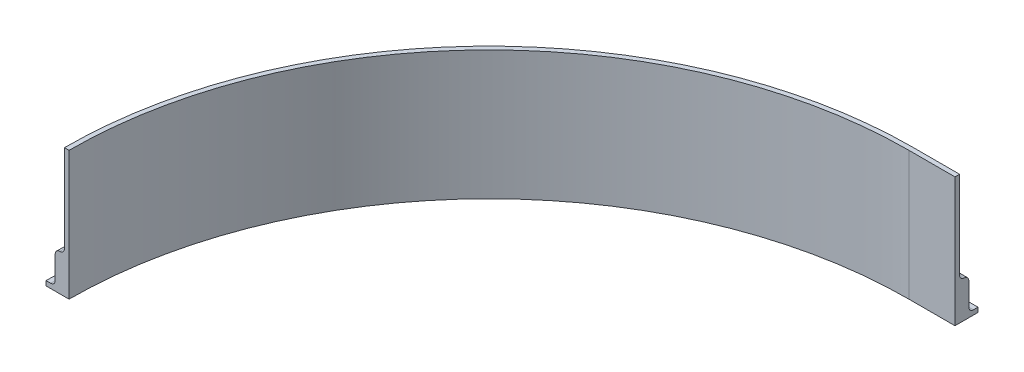
ISO-10303-21;
HEADER;
FILE_DESCRIPTION(('STEP AP214'),'2;1');
FILE_NAME('part.step','',(''),(''),'','','');
FILE_SCHEMA(('AUTOMOTIVE_DESIGN { 1 0 10303 214 1 1 1 1 }'));
ENDSEC;
DATA;
#1=APPLICATION_CONTEXT('core data for automotive mechanical design processes');
#2=APPLICATION_PROTOCOL_DEFINITION('international standard','automotive_design',2000,#1);
#3=PRODUCT_CONTEXT('',#1,'mechanical');
#4=PRODUCT('Part','Part','',(#3));
#5=PRODUCT_RELATED_PRODUCT_CATEGORY('part','',(#4));
#6=PRODUCT_DEFINITION_FORMATION('','',#4);
#7=PRODUCT_DEFINITION_CONTEXT('part definition',#1,'design');
#8=PRODUCT_DEFINITION('design','',#6,#7);
#9=PRODUCT_DEFINITION_SHAPE('','',#8);
#10=(LENGTH_UNIT() NAMED_UNIT(*) SI_UNIT(.MILLI.,.METRE.));
#11=(NAMED_UNIT(*) PLANE_ANGLE_UNIT() SI_UNIT($,.RADIAN.));
#12=(NAMED_UNIT(*) SI_UNIT($,.STERADIAN.) SOLID_ANGLE_UNIT());
#13=UNCERTAINTY_MEASURE_WITH_UNIT(LENGTH_MEASURE(1.E-05),#10,'distance_accuracy_value','');
#14=(GEOMETRIC_REPRESENTATION_CONTEXT(3) GLOBAL_UNCERTAINTY_ASSIGNED_CONTEXT((#13)) GLOBAL_UNIT_ASSIGNED_CONTEXT((#10,
#11,#12)) REPRESENTATION_CONTEXT('',''));
#15=CARTESIAN_POINT('',(0.,0.,0.));
#16=DIRECTION('',(0.,0.,1.));
#17=DIRECTION('',(1.,0.,0.));
#18=AXIS2_PLACEMENT_3D('',#15,#16,#17);
#19=CARTESIAN_POINT('',(481.,5.,0.));
#20=DIRECTION('',(0.,-1.,0.));
#21=DIRECTION('',(0.,0.,-1.));
#22=AXIS2_PLACEMENT_3D('',#19,#20,#21);
#23=PLANE('',#22);
#24=CARTESIAN_POINT('',(481.,5.,0.));
#25=DIRECTION('',(0.,-1.,0.));
#26=DIRECTION('',(0.,0.,-1.));
#27=AXIS2_PLACEMENT_3D('',#24,#25,#26);
#28=CIRCLE('',#27,476.);
#29=CARTESIAN_POINT('',(5.,5.,0.));
#30=VERTEX_POINT('',#29);
#31=CARTESIAN_POINT('',(481.,5.,-476.));
#32=VERTEX_POINT('',#31);
#33=EDGE_CURVE('E188',#30,#32,#28,.T.);
#34=ORIENTED_EDGE('',*,*,#33,.T.);
#35=DIRECTION('',(-1.,0.,0.));
#36=VECTOR('',#35,1.);
#37=CARTESIAN_POINT('',(531.,5.,-476.));
#38=LINE('',#37,#36);
#39=CARTESIAN_POINT('',(531.,5.,-476.));
#40=VERTEX_POINT('',#39);
#41=EDGE_CURVE('E186',#32,#40,#38,.F.);
#42=ORIENTED_EDGE('',*,*,#41,.T.);
#43=DIRECTION('',(0.,0.,-1.));
#44=VECTOR('',#43,1.);
#45=CARTESIAN_POINT('',(531.,5.,-481.));
#46=LINE('',#45,#44);
#47=CARTESIAN_POINT('',(531.,5.,-481.));
#48=VERTEX_POINT('',#47);
#49=EDGE_CURVE('E231',#40,#48,#46,.T.);
#50=ORIENTED_EDGE('',*,*,#49,.T.);
#51=DIRECTION('',(-1.,0.,0.));
#52=VECTOR('',#51,1.);
#53=CARTESIAN_POINT('',(481.,5.,-481.));
#54=LINE('',#53,#52);
#55=CARTESIAN_POINT('',(481.,5.,-481.));
#56=VERTEX_POINT('',#55);
#57=EDGE_CURVE('E214',#48,#56,#54,.T.);
#58=ORIENTED_EDGE('',*,*,#57,.T.);
#59=CARTESIAN_POINT('',(481.,5.,0.));
#60=DIRECTION('',(0.,1.,0.));
#61=DIRECTION('',(0.,0.,-1.));
#62=AXIS2_PLACEMENT_3D('',#59,#60,#61);
#63=CIRCLE('',#62,481.);
#64=CARTESIAN_POINT('',(0.,5.,0.));
#65=VERTEX_POINT('',#64);
#66=EDGE_CURVE('E217',#56,#65,#63,.T.);
#67=ORIENTED_EDGE('',*,*,#66,.T.);
#68=DIRECTION('',(1.,0.,0.));
#69=VECTOR('',#68,1.);
#70=CARTESIAN_POINT('',(0.,5.,0.));
#71=LINE('',#70,#69);
#72=EDGE_CURVE('E233',#65,#30,#71,.T.);
#73=ORIENTED_EDGE('',*,*,#72,.T.);
#74=EDGE_LOOP('',(#34,#42,#50,#58,#67,#73));
#75=FACE_BOUND('',#74,.T.);
#76=ADVANCED_FACE('F33',(#75),#23,.F.);
#77=CARTESIAN_POINT('',(481.,5.,0.));
#78=DIRECTION('',(0.,-1.,0.));
#79=DIRECTION('',(0.,0.,-1.));
#80=AXIS2_PLACEMENT_3D('',#77,#78,#79);
#81=CYLINDRICAL_SURFACE('',#80,481.);
#82=CARTESIAN_POINT('',(481.,0.,0.));
#83=DIRECTION('',(0.,1.,0.));
#84=DIRECTION('',(0.,0.,-1.));
#85=AXIS2_PLACEMENT_3D('',#82,#83,#84);
#86=CIRCLE('',#85,481.);
#87=CARTESIAN_POINT('',(481.,0.,-481.));
#88=VERTEX_POINT('',#87);
#89=CARTESIAN_POINT('',(0.,0.,0.));
#90=VERTEX_POINT('',#89);
#91=EDGE_CURVE('E226',#88,#90,#86,.T.);
#92=ORIENTED_EDGE('',*,*,#91,.T.);
#93=DIRECTION('',(0.,-1.,0.));
#94=VECTOR('',#93,1.);
#95=CARTESIAN_POINT('',(0.,5.,0.));
#96=LINE('',#95,#94);
#97=EDGE_CURVE('E198',#65,#90,#96,.T.);
#98=ORIENTED_EDGE('',*,*,#97,.F.);
#99=ORIENTED_EDGE('',*,*,#66,.F.);
#100=DIRECTION('',(0.,-1.,0.));
#101=VECTOR('',#100,1.);
#102=CARTESIAN_POINT('',(481.,5.,-481.));
#103=LINE('',#102,#101);
#104=EDGE_CURVE('E211',#56,#88,#103,.T.);
#105=ORIENTED_EDGE('',*,*,#104,.T.);
#106=EDGE_LOOP('',(#92,#98,#99,#105));
#107=FACE_BOUND('',#106,.T.);
#108=ADVANCED_FACE('F296',(#107),#81,.T.);
#109=CARTESIAN_POINT('',(0.,5.,0.));
#110=DIRECTION('',(0.,0.,-1.));
#111=DIRECTION('',(-1.,0.,0.));
#112=AXIS2_PLACEMENT_3D('',#109,#110,#111);
#113=PLANE('',#112);
#114=DIRECTION('',(0.,-1.,0.));
#115=VECTOR('',#114,1.);
#116=CARTESIAN_POINT('',(20.,140.,0.));
#117=LINE('',#116,#115);
#118=CARTESIAN_POINT('',(20.,140.,0.));
#119=VERTEX_POINT('',#118);
#120=CARTESIAN_POINT('',(20.,45.,0.));
#121=VERTEX_POINT('',#120);
#122=EDGE_CURVE('E250',#119,#121,#117,.T.);
#123=ORIENTED_EDGE('',*,*,#122,.T.);
#124=CARTESIAN_POINT('',(15.,45.,0.));
#125=DIRECTION('',(0.,0.,-1.));
#126=DIRECTION('',(-1.,0.,0.));
#127=AXIS2_PLACEMENT_3D('',#124,#125,#126);
#128=CIRCLE('',#127,5.);
#129=CARTESIAN_POINT('',(15.,40.,0.));
#130=VERTEX_POINT('',#129);
#131=EDGE_CURVE('E43',#121,#130,#128,.T.);
#132=ORIENTED_EDGE('',*,*,#131,.T.);
#133=CARTESIAN_POINT('',(15.,35.,0.));
#134=DIRECTION('',(0.,0.,-1.));
#135=DIRECTION('',(-1.,0.,0.));
#136=AXIS2_PLACEMENT_3D('',#133,#134,#135);
#137=CIRCLE('',#136,5.);
#138=CARTESIAN_POINT('',(10.,35.,0.));
#139=VERTEX_POINT('',#138);
#140=EDGE_CURVE('E160',#130,#139,#137,.F.);
#141=ORIENTED_EDGE('',*,*,#140,.T.);
#142=DIRECTION('',(0.,-1.,0.));
#143=VECTOR('',#142,1.);
#144=CARTESIAN_POINT('',(10.,40.,0.));
#145=LINE('',#144,#143);
#146=CARTESIAN_POINT('',(10.,10.,0.));
#147=VERTEX_POINT('',#146);
#148=EDGE_CURVE('E242',#139,#147,#145,.T.);
#149=ORIENTED_EDGE('',*,*,#148,.T.);
#150=CARTESIAN_POINT('',(5.,10.,0.));
#151=DIRECTION('',(0.,0.,-1.));
#152=DIRECTION('',(-1.,0.,0.));
#153=AXIS2_PLACEMENT_3D('',#150,#151,#152);
#154=CIRCLE('',#153,5.);
#155=EDGE_CURVE('E11',#147,#30,#154,.T.);
#156=ORIENTED_EDGE('',*,*,#155,.T.);
#157=ORIENTED_EDGE('',*,*,#72,.F.);
#158=ORIENTED_EDGE('',*,*,#97,.T.);
#159=DIRECTION('',(1.,0.,0.));
#160=VECTOR('',#159,1.);
#161=CARTESIAN_POINT('',(0.,0.,0.));
#162=LINE('',#161,#160);
#163=CARTESIAN_POINT('',(25.,0.,0.));
#164=VERTEX_POINT('',#163);
#165=EDGE_CURVE('E224',#90,#164,#162,.T.);
#166=ORIENTED_EDGE('',*,*,#165,.T.);
#167=DIRECTION('',(0.,-1.,0.));
#168=VECTOR('',#167,1.);
#169=CARTESIAN_POINT('',(25.,5.,0.));
#170=LINE('',#169,#168);
#171=CARTESIAN_POINT('',(25.,140.,0.));
#172=VERTEX_POINT('',#171);
#173=EDGE_CURVE('E201',#172,#164,#170,.T.);
#174=ORIENTED_EDGE('',*,*,#173,.F.);
#175=DIRECTION('',(1.,0.,0.));
#176=VECTOR('',#175,1.);
#177=CARTESIAN_POINT('',(20.,140.,0.));
#178=LINE('',#177,#176);
#179=EDGE_CURVE('E253',#119,#172,#178,.T.);
#180=ORIENTED_EDGE('',*,*,#179,.F.);
#181=EDGE_LOOP('',(#123,#132,#141,#149,#156,#157,#158,#166,#174,#180));
#182=FACE_BOUND('',#181,.T.);
#183=ADVANCED_FACE('F294',(#182),#113,.F.);
#184=CARTESIAN_POINT('',(481.,5.,0.));
#185=DIRECTION('',(0.,-1.,0.));
#186=DIRECTION('',(0.,0.,-1.));
#187=AXIS2_PLACEMENT_3D('',#184,#185,#186);
#188=CYLINDRICAL_SURFACE('',#187,456.);
#189=CARTESIAN_POINT('',(481.,0.,0.));
#190=DIRECTION('',(0.,-1.,0.));
#191=DIRECTION('',(0.,0.,-1.));
#192=AXIS2_PLACEMENT_3D('',#189,#190,#191);
#193=CIRCLE('',#192,456.);
#194=CARTESIAN_POINT('',(481.,0.,-456.));
#195=VERTEX_POINT('',#194);
#196=EDGE_CURVE('E222',#164,#195,#193,.T.);
#197=ORIENTED_EDGE('',*,*,#196,.T.);
#198=DIRECTION('',(0.,-1.,0.));
#199=VECTOR('',#198,1.);
#200=CARTESIAN_POINT('',(481.,5.,-456.));
#201=LINE('',#200,#199);
#202=CARTESIAN_POINT('',(481.,140.,-456.));
#203=VERTEX_POINT('',#202);
#204=EDGE_CURVE('E138',#203,#195,#201,.T.);
#205=ORIENTED_EDGE('',*,*,#204,.F.);
#206=CARTESIAN_POINT('',(481.,140.,0.));
#207=DIRECTION('',(0.,-1.,0.));
#208=DIRECTION('',(0.,0.,1.));
#209=AXIS2_PLACEMENT_3D('',#206,#207,#208);
#210=CIRCLE('',#209,456.);
#211=EDGE_CURVE('E155',#172,#203,#210,.T.);
#212=ORIENTED_EDGE('',*,*,#211,.F.);
#213=ORIENTED_EDGE('',*,*,#173,.T.);
#214=EDGE_LOOP('',(#197,#205,#212,#213));
#215=FACE_BOUND('',#214,.T.);
#216=ADVANCED_FACE('F270',(#215),#188,.F.);
#217=CARTESIAN_POINT('',(531.,5.,-456.));
#218=DIRECTION('',(0.,0.,-1.));
#219=DIRECTION('',(-1.,0.,0.));
#220=AXIS2_PLACEMENT_3D('',#217,#218,#219);
#221=PLANE('',#220);
#222=DIRECTION('',(1.,0.,0.));
#223=VECTOR('',#222,1.);
#224=CARTESIAN_POINT('',(531.,0.,-456.));
#225=LINE('',#224,#223);
#226=CARTESIAN_POINT('',(531.,0.,-456.));
#227=VERTEX_POINT('',#226);
#228=EDGE_CURVE('E220',#195,#227,#225,.T.);
#229=ORIENTED_EDGE('',*,*,#228,.T.);
#230=DIRECTION('',(0.,-1.,0.));
#231=VECTOR('',#230,1.);
#232=CARTESIAN_POINT('',(531.,5.,-456.));
#233=LINE('',#232,#231);
#234=CARTESIAN_POINT('',(531.,140.,-456.));
#235=VERTEX_POINT('',#234);
#236=EDGE_CURVE('E205',#235,#227,#233,.T.);
#237=ORIENTED_EDGE('',*,*,#236,.F.);
#238=DIRECTION('',(1.,0.,0.));
#239=VECTOR('',#238,1.);
#240=CARTESIAN_POINT('',(481.,140.,-456.));
#241=LINE('',#240,#239);
#242=EDGE_CURVE('E262',#203,#235,#241,.T.);
#243=ORIENTED_EDGE('',*,*,#242,.F.);
#244=ORIENTED_EDGE('',*,*,#204,.T.);
#245=EDGE_LOOP('',(#229,#237,#243,#244));
#246=FACE_BOUND('',#245,.T.);
#247=ADVANCED_FACE('F280',(#246),#221,.F.);
#248=CARTESIAN_POINT('',(531.,5.,-481.));
#249=DIRECTION('',(-1.,0.,0.));
#250=DIRECTION('',(0.,0.,1.));
#251=AXIS2_PLACEMENT_3D('',#248,#249,#250);
#252=PLANE('',#251);
#253=DIRECTION('',(0.,-1.,0.));
#254=VECTOR('',#253,1.);
#255=CARTESIAN_POINT('',(531.,40.,-471.));
#256=LINE('',#255,#254);
#257=CARTESIAN_POINT('',(531.,35.,-471.));
#258=VERTEX_POINT('',#257);
#259=CARTESIAN_POINT('',(531.,10.,-471.));
#260=VERTEX_POINT('',#259);
#261=EDGE_CURVE('E229',#258,#260,#256,.T.);
#262=ORIENTED_EDGE('',*,*,#261,.F.);
#263=CARTESIAN_POINT('',(531.,35.,-466.));
#264=DIRECTION('',(-1.,0.,0.));
#265=DIRECTION('',(0.,0.,1.));
#266=AXIS2_PLACEMENT_3D('',#263,#264,#265);
#267=CIRCLE('',#266,5.);
#268=CARTESIAN_POINT('',(531.,40.,-466.));
#269=VERTEX_POINT('',#268);
#270=EDGE_CURVE('E190',#258,#269,#267,.F.);
#271=ORIENTED_EDGE('',*,*,#270,.T.);
#272=CARTESIAN_POINT('',(531.,45.,-466.));
#273=DIRECTION('',(-1.,0.,0.));
#274=DIRECTION('',(0.,0.,1.));
#275=AXIS2_PLACEMENT_3D('',#272,#273,#274);
#276=CIRCLE('',#275,5.);
#277=CARTESIAN_POINT('',(531.,45.,-461.));
#278=VERTEX_POINT('',#277);
#279=EDGE_CURVE('E170',#269,#278,#276,.T.);
#280=ORIENTED_EDGE('',*,*,#279,.T.);
#281=DIRECTION('',(0.,-1.,0.));
#282=VECTOR('',#281,1.);
#283=CARTESIAN_POINT('',(531.,140.,-461.));
#284=LINE('',#283,#282);
#285=CARTESIAN_POINT('',(531.,140.,-461.));
#286=VERTEX_POINT('',#285);
#287=EDGE_CURVE('E244',#286,#278,#284,.T.);
#288=ORIENTED_EDGE('',*,*,#287,.F.);
#289=DIRECTION('',(0.,0.,-1.));
#290=VECTOR('',#289,1.);
#291=CARTESIAN_POINT('',(531.,140.,-461.));
#292=LINE('',#291,#290);
#293=EDGE_CURVE('E260',#235,#286,#292,.T.);
#294=ORIENTED_EDGE('',*,*,#293,.F.);
#295=ORIENTED_EDGE('',*,*,#236,.T.);
#296=DIRECTION('',(0.,0.,-1.));
#297=VECTOR('',#296,1.);
#298=CARTESIAN_POINT('',(531.,0.,-481.));
#299=LINE('',#298,#297);
#300=CARTESIAN_POINT('',(531.,0.,-481.));
#301=VERTEX_POINT('',#300);
#302=EDGE_CURVE('E218',#227,#301,#299,.T.);
#303=ORIENTED_EDGE('',*,*,#302,.T.);
#304=DIRECTION('',(0.,-1.,0.));
#305=VECTOR('',#304,1.);
#306=CARTESIAN_POINT('',(531.,5.,-481.));
#307=LINE('',#306,#305);
#308=EDGE_CURVE('E208',#48,#301,#307,.T.);
#309=ORIENTED_EDGE('',*,*,#308,.F.);
#310=ORIENTED_EDGE('',*,*,#49,.F.);
#311=CARTESIAN_POINT('',(531.,10.,-476.));
#312=DIRECTION('',(-1.,0.,0.));
#313=DIRECTION('',(0.,0.,1.));
#314=AXIS2_PLACEMENT_3D('',#311,#312,#313);
#315=CIRCLE('',#314,5.);
#316=EDGE_CURVE('E178',#40,#260,#315,.T.);
#317=ORIENTED_EDGE('',*,*,#316,.T.);
#318=EDGE_LOOP('',(#262,#271,#280,#288,#294,#295,#303,#309,#310,#317));
#319=FACE_BOUND('',#318,.T.);
#320=ADVANCED_FACE('F283',(#319),#252,.F.);
#321=CARTESIAN_POINT('',(481.,5.,-481.));
#322=DIRECTION('',(0.,0.,1.));
#323=DIRECTION('',(1.,0.,0.));
#324=AXIS2_PLACEMENT_3D('',#321,#322,#323);
#325=PLANE('',#324);
#326=DIRECTION('',(-1.,0.,0.));
#327=VECTOR('',#326,1.);
#328=CARTESIAN_POINT('',(481.,0.,-481.));
#329=LINE('',#328,#327);
#330=EDGE_CURVE('E215',#301,#88,#329,.T.);
#331=ORIENTED_EDGE('',*,*,#330,.T.);
#332=ORIENTED_EDGE('',*,*,#104,.F.);
#333=ORIENTED_EDGE('',*,*,#57,.F.);
#334=ORIENTED_EDGE('',*,*,#308,.T.);
#335=EDGE_LOOP('',(#331,#332,#333,#334));
#336=FACE_BOUND('',#335,.T.);
#337=ADVANCED_FACE('F316',(#336),#325,.F.);
#338=CARTESIAN_POINT('',(481.,0.,0.));
#339=DIRECTION('',(0.,-1.,0.));
#340=DIRECTION('',(0.,0.,-1.));
#341=AXIS2_PLACEMENT_3D('',#338,#339,#340);
#342=PLANE('',#341);
#343=ORIENTED_EDGE('',*,*,#91,.F.);
#344=ORIENTED_EDGE('',*,*,#330,.F.);
#345=ORIENTED_EDGE('',*,*,#302,.F.);
#346=ORIENTED_EDGE('',*,*,#228,.F.);
#347=ORIENTED_EDGE('',*,*,#196,.F.);
#348=ORIENTED_EDGE('',*,*,#165,.F.);
#349=EDGE_LOOP('',(#343,#344,#345,#346,#347,#348));
#350=FACE_BOUND('',#349,.T.);
#351=ADVANCED_FACE('F276',(#350),#342,.T.);
#352=CARTESIAN_POINT('',(481.,40.,-471.));
#353=DIRECTION('',(0.,0.,1.));
#354=DIRECTION('',(1.,0.,0.));
#355=AXIS2_PLACEMENT_3D('',#352,#353,#354);
#356=PLANE('',#355);
#357=DIRECTION('',(0.,-1.,0.));
#358=VECTOR('',#357,1.);
#359=CARTESIAN_POINT('',(481.,40.,-471.));
#360=LINE('',#359,#358);
#361=CARTESIAN_POINT('',(481.,35.,-471.));
#362=VERTEX_POINT('',#361);
#363=CARTESIAN_POINT('',(481.,10.,-471.));
#364=VERTEX_POINT('',#363);
#365=EDGE_CURVE('E240',#362,#364,#360,.T.);
#366=ORIENTED_EDGE('',*,*,#365,.F.);
#367=DIRECTION('',(-1.,0.,0.));
#368=VECTOR('',#367,1.);
#369=CARTESIAN_POINT('',(531.,35.,-471.));
#370=LINE('',#369,#368);
#371=EDGE_CURVE('E152',#362,#258,#370,.F.);
#372=ORIENTED_EDGE('',*,*,#371,.T.);
#373=ORIENTED_EDGE('',*,*,#261,.T.);
#374=DIRECTION('',(-1.,0.,0.));
#375=VECTOR('',#374,1.);
#376=CARTESIAN_POINT('',(481.,10.,-471.));
#377=LINE('',#376,#375);
#378=EDGE_CURVE('E193',#260,#364,#377,.T.);
#379=ORIENTED_EDGE('',*,*,#378,.T.);
#380=EDGE_LOOP('',(#366,#372,#373,#379));
#381=FACE_BOUND('',#380,.T.);
#382=ADVANCED_FACE('F312',(#381),#356,.F.);
#383=CARTESIAN_POINT('',(481.,40.,0.));
#384=DIRECTION('',(0.,-1.,0.));
#385=DIRECTION('',(0.,0.,-1.));
#386=AXIS2_PLACEMENT_3D('',#383,#384,#385);
#387=CYLINDRICAL_SURFACE('',#386,471.);
#388=ORIENTED_EDGE('',*,*,#148,.F.);
#389=CARTESIAN_POINT('',(481.,35.,0.));
#390=DIRECTION('',(0.,1.,0.));
#391=DIRECTION('',(0.,0.,1.));
#392=AXIS2_PLACEMENT_3D('',#389,#390,#391);
#393=CIRCLE('',#392,471.);
#394=EDGE_CURVE('E181',#139,#362,#393,.F.);
#395=ORIENTED_EDGE('',*,*,#394,.T.);
#396=ORIENTED_EDGE('',*,*,#365,.T.);
#397=CARTESIAN_POINT('',(481.,10.,0.));
#398=DIRECTION('',(0.,-1.,0.));
#399=DIRECTION('',(0.,0.,-1.));
#400=AXIS2_PLACEMENT_3D('',#397,#398,#399);
#401=CIRCLE('',#400,471.);
#402=EDGE_CURVE('E51',#364,#147,#401,.F.);
#403=ORIENTED_EDGE('',*,*,#402,.T.);
#404=EDGE_LOOP('',(#388,#395,#396,#403));
#405=FACE_BOUND('',#404,.T.);
#406=ADVANCED_FACE('F347',(#405),#387,.T.);
#407=CARTESIAN_POINT('',(481.,140.,-461.));
#408=DIRECTION('',(0.,0.,1.));
#409=DIRECTION('',(1.,0.,0.));
#410=AXIS2_PLACEMENT_3D('',#407,#408,#409);
#411=PLANE('',#410);
#412=ORIENTED_EDGE('',*,*,#287,.T.);
#413=DIRECTION('',(-1.,0.,0.));
#414=VECTOR('',#413,1.);
#415=CARTESIAN_POINT('',(481.,45.,-461.));
#416=LINE('',#415,#414);
#417=CARTESIAN_POINT('',(481.,45.,-461.));
#418=VERTEX_POINT('',#417);
#419=EDGE_CURVE('E196',#278,#418,#416,.T.);
#420=ORIENTED_EDGE('',*,*,#419,.T.);
#421=DIRECTION('',(0.,-1.,0.));
#422=VECTOR('',#421,1.);
#423=CARTESIAN_POINT('',(481.,140.,-461.));
#424=LINE('',#423,#422);
#425=CARTESIAN_POINT('',(481.,140.,-461.));
#426=VERTEX_POINT('',#425);
#427=EDGE_CURVE('E247',#426,#418,#424,.T.);
#428=ORIENTED_EDGE('',*,*,#427,.F.);
#429=DIRECTION('',(-1.,0.,0.));
#430=VECTOR('',#429,1.);
#431=CARTESIAN_POINT('',(481.,140.,-461.));
#432=LINE('',#431,#430);
#433=EDGE_CURVE('E258',#286,#426,#432,.T.);
#434=ORIENTED_EDGE('',*,*,#433,.F.);
#435=EDGE_LOOP('',(#412,#420,#428,#434));
#436=FACE_BOUND('',#435,.T.);
#437=ADVANCED_FACE('F291',(#436),#411,.F.);
#438=CARTESIAN_POINT('',(481.,140.,0.));
#439=DIRECTION('',(0.,-1.,0.));
#440=DIRECTION('',(0.,0.,-1.));
#441=AXIS2_PLACEMENT_3D('',#438,#439,#440);
#442=CYLINDRICAL_SURFACE('',#441,461.);
#443=ORIENTED_EDGE('',*,*,#427,.T.);
#444=CARTESIAN_POINT('',(481.,45.,0.));
#445=DIRECTION('',(0.,1.,0.));
#446=DIRECTION('',(0.,0.,1.));
#447=AXIS2_PLACEMENT_3D('',#444,#445,#446);
#448=CIRCLE('',#447,461.);
#449=EDGE_CURVE('E173',#418,#121,#448,.T.);
#450=ORIENTED_EDGE('',*,*,#449,.T.);
#451=ORIENTED_EDGE('',*,*,#122,.F.);
#452=CARTESIAN_POINT('',(481.,140.,0.));
#453=DIRECTION('',(0.,1.,0.));
#454=DIRECTION('',(0.,0.,1.));
#455=AXIS2_PLACEMENT_3D('',#452,#453,#454);
#456=CIRCLE('',#455,461.);
#457=EDGE_CURVE('E256',#426,#119,#456,.T.);
#458=ORIENTED_EDGE('',*,*,#457,.F.);
#459=EDGE_LOOP('',(#443,#450,#451,#458));
#460=FACE_BOUND('',#459,.T.);
#461=ADVANCED_FACE('F293',(#460),#442,.T.);
#462=CARTESIAN_POINT('',(481.,140.,0.));
#463=DIRECTION('',(0.,1.,0.));
#464=DIRECTION('',(0.,0.,1.));
#465=AXIS2_PLACEMENT_3D('',#462,#463,#464);
#466=PLANE('',#465);
#467=ORIENTED_EDGE('',*,*,#211,.T.);
#468=ORIENTED_EDGE('',*,*,#242,.T.);
#469=ORIENTED_EDGE('',*,*,#293,.T.);
#470=ORIENTED_EDGE('',*,*,#433,.T.);
#471=ORIENTED_EDGE('',*,*,#457,.T.);
#472=ORIENTED_EDGE('',*,*,#179,.T.);
#473=EDGE_LOOP('',(#467,#468,#469,#470,#471,#472));
#474=FACE_BOUND('',#473,.T.);
#475=ADVANCED_FACE('F267',(#474),#466,.T.);
#476=CARTESIAN_POINT('',(481.,35.,0.));
#477=DIRECTION('',(0.,1.,0.));
#478=DIRECTION('',(0.,0.,1.));
#479=AXIS2_PLACEMENT_3D('',#476,#477,#478);
#480=TOROIDAL_SURFACE('',#479,466.,5.);
#481=CARTESIAN_POINT('',(481.,35.,-466.));
#482=DIRECTION('',(1.,0.,0.));
#483=DIRECTION('',(0.,0.,-1.));
#484=AXIS2_PLACEMENT_3D('',#481,#482,#483);
#485=CIRCLE('',#484,5.);
#486=CARTESIAN_POINT('',(481.,40.,-466.));
#487=VERTEX_POINT('',#486);
#488=EDGE_CURVE('E145',#362,#487,#485,.T.);
#489=ORIENTED_EDGE('',*,*,#488,.F.);
#490=ORIENTED_EDGE('',*,*,#394,.F.);
#491=ORIENTED_EDGE('',*,*,#140,.F.);
#492=CARTESIAN_POINT('',(481.,40.,0.));
#493=DIRECTION('',(0.,1.,0.));
#494=DIRECTION('',(0.,0.,1.));
#495=AXIS2_PLACEMENT_3D('',#492,#493,#494);
#496=CIRCLE('',#495,466.);
#497=EDGE_CURVE('E156',#487,#130,#496,.T.);
#498=ORIENTED_EDGE('',*,*,#497,.F.);
#499=EDGE_LOOP('',(#489,#490,#491,#498));
#500=FACE_BOUND('',#499,.T.);
#501=ADVANCED_FACE('F159',(#500),#480,.T.);
#502=CARTESIAN_POINT('',(481.,35.,-466.));
#503=DIRECTION('',(1.,0.,0.));
#504=DIRECTION('',(0.,0.,-1.));
#505=AXIS2_PLACEMENT_3D('',#502,#503,#504);
#506=CYLINDRICAL_SURFACE('',#505,5.);
#507=ORIENTED_EDGE('',*,*,#371,.F.);
#508=ORIENTED_EDGE('',*,*,#488,.T.);
#509=DIRECTION('',(-1.,0.,0.));
#510=VECTOR('',#509,1.);
#511=CARTESIAN_POINT('',(481.,40.,-466.));
#512=LINE('',#511,#510);
#513=EDGE_CURVE('E150',#269,#487,#512,.T.);
#514=ORIENTED_EDGE('',*,*,#513,.F.);
#515=ORIENTED_EDGE('',*,*,#270,.F.);
#516=EDGE_LOOP('',(#507,#508,#514,#515));
#517=FACE_BOUND('',#516,.T.);
#518=ADVANCED_FACE('F147',(#517),#506,.T.);
#519=CARTESIAN_POINT('',(481.,45.,0.));
#520=DIRECTION('',(0.,1.,0.));
#521=DIRECTION('',(0.,0.,1.));
#522=AXIS2_PLACEMENT_3D('',#519,#520,#521);
#523=TOROIDAL_SURFACE('',#522,466.,5.);
#524=ORIENTED_EDGE('',*,*,#131,.F.);
#525=ORIENTED_EDGE('',*,*,#449,.F.);
#526=CARTESIAN_POINT('',(481.,45.,-466.));
#527=DIRECTION('',(-1.,0.,0.));
#528=DIRECTION('',(0.,0.,1.));
#529=AXIS2_PLACEMENT_3D('',#526,#527,#528);
#530=CIRCLE('',#529,5.);
#531=EDGE_CURVE('E168',#487,#418,#530,.T.);
#532=ORIENTED_EDGE('',*,*,#531,.F.);
#533=ORIENTED_EDGE('',*,*,#497,.T.);
#534=EDGE_LOOP('',(#524,#525,#532,#533));
#535=FACE_BOUND('',#534,.T.);
#536=ADVANCED_FACE('F172',(#535),#523,.F.);
#537=CARTESIAN_POINT('',(481.,45.,-466.));
#538=DIRECTION('',(-1.,0.,0.));
#539=DIRECTION('',(0.,0.,1.));
#540=AXIS2_PLACEMENT_3D('',#537,#538,#539);
#541=CYLINDRICAL_SURFACE('',#540,5.);
#542=ORIENTED_EDGE('',*,*,#279,.F.);
#543=ORIENTED_EDGE('',*,*,#513,.T.);
#544=ORIENTED_EDGE('',*,*,#531,.T.);
#545=ORIENTED_EDGE('',*,*,#419,.F.);
#546=EDGE_LOOP('',(#542,#543,#544,#545));
#547=FACE_BOUND('',#546,.T.);
#548=ADVANCED_FACE('F166',(#547),#541,.F.);
#549=CARTESIAN_POINT('',(481.,10.,0.));
#550=DIRECTION('',(0.,-1.,0.));
#551=DIRECTION('',(0.,0.,-1.));
#552=AXIS2_PLACEMENT_3D('',#549,#550,#551);
#553=TOROIDAL_SURFACE('',#552,476.,5.);
#554=ORIENTED_EDGE('',*,*,#155,.F.);
#555=ORIENTED_EDGE('',*,*,#402,.F.);
#556=CARTESIAN_POINT('',(481.,10.,-476.));
#557=DIRECTION('',(-1.,0.,0.));
#558=DIRECTION('',(0.,0.,1.));
#559=AXIS2_PLACEMENT_3D('',#556,#557,#558);
#560=CIRCLE('',#559,5.);
#561=EDGE_CURVE('E37',#32,#364,#560,.T.);
#562=ORIENTED_EDGE('',*,*,#561,.F.);
#563=ORIENTED_EDGE('',*,*,#33,.F.);
#564=EDGE_LOOP('',(#554,#555,#562,#563));
#565=FACE_BOUND('',#564,.T.);
#566=ADVANCED_FACE('F35',(#565),#553,.F.);
#567=CARTESIAN_POINT('',(481.,10.,-476.));
#568=DIRECTION('',(1.,0.,0.));
#569=DIRECTION('',(0.,0.,-1.));
#570=AXIS2_PLACEMENT_3D('',#567,#568,#569);
#571=CYLINDRICAL_SURFACE('',#570,5.);
#572=ORIENTED_EDGE('',*,*,#316,.F.);
#573=ORIENTED_EDGE('',*,*,#41,.F.);
#574=ORIENTED_EDGE('',*,*,#561,.T.);
#575=ORIENTED_EDGE('',*,*,#378,.F.);
#576=EDGE_LOOP('',(#572,#573,#574,#575));
#577=FACE_BOUND('',#576,.T.);
#578=ADVANCED_FACE('F400',(#577),#571,.F.);
#579=CLOSED_SHELL('',(#76,#108,#183,#216,#247,#320,#337,#351,#382,#406,#437,#461,#475,#501,#518,
#536,#548,#566,#578));
#580=MANIFOLD_SOLID_BREP('B2',#579);
#581=ADVANCED_BREP_SHAPE_REPRESENTATION('',(#18,#580),#14);
#582=SHAPE_DEFINITION_REPRESENTATION(#9,#581);
ENDSEC;
END-ISO-10303-21;
